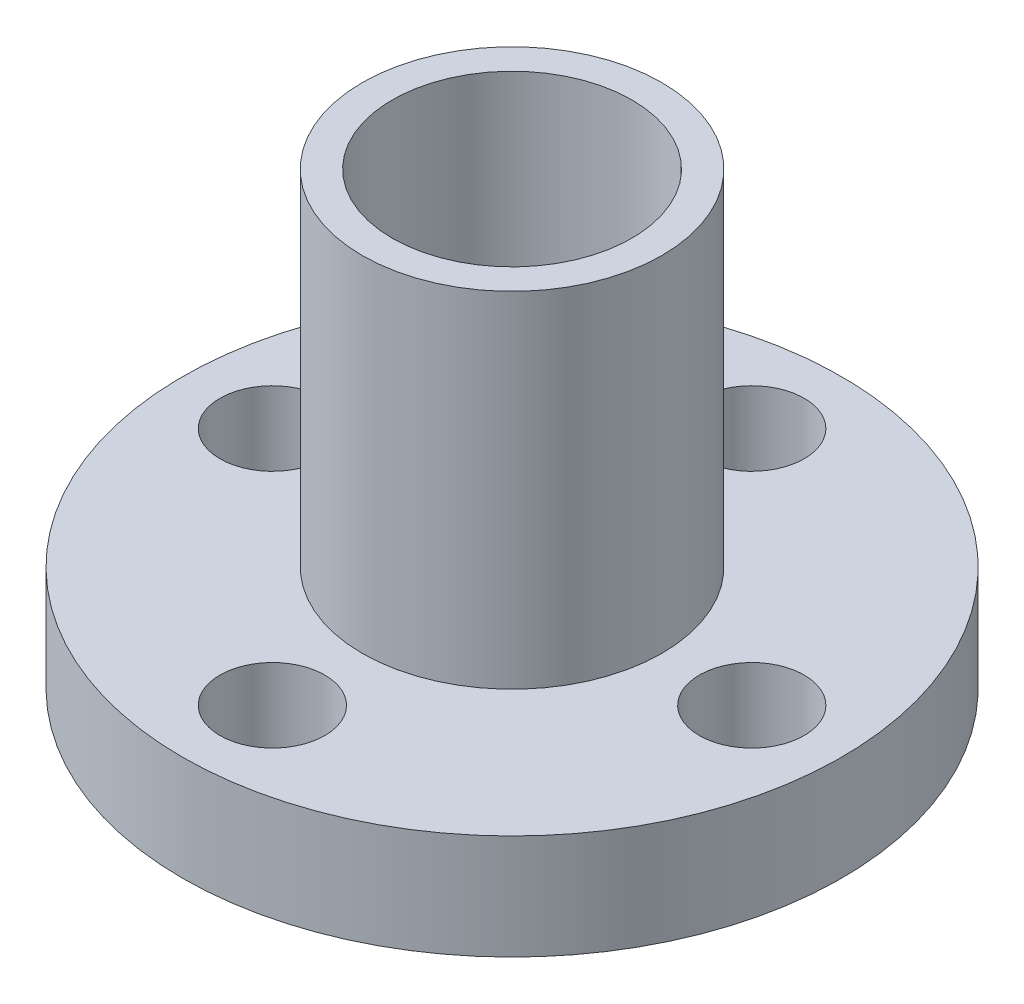
ISO-10303-21;
HEADER;
FILE_DESCRIPTION(('STEP AP214'),'2;1');
FILE_NAME('part.step','',(''),(''),'','','');
FILE_SCHEMA(('AUTOMOTIVE_DESIGN { 1 0 10303 214 1 1 1 1 }'));
ENDSEC;
DATA;
#1=APPLICATION_CONTEXT('core data for automotive mechanical design processes');
#2=APPLICATION_PROTOCOL_DEFINITION('international standard','automotive_design',2000,#1);
#3=PRODUCT_CONTEXT('',#1,'mechanical');
#4=PRODUCT('Part','Part','',(#3));
#5=PRODUCT_RELATED_PRODUCT_CATEGORY('part','',(#4));
#6=PRODUCT_DEFINITION_FORMATION('','',#4);
#7=PRODUCT_DEFINITION_CONTEXT('part definition',#1,'design');
#8=PRODUCT_DEFINITION('design','',#6,#7);
#9=PRODUCT_DEFINITION_SHAPE('','',#8);
#10=(LENGTH_UNIT() NAMED_UNIT(*) SI_UNIT(.MILLI.,.METRE.));
#11=(NAMED_UNIT(*) PLANE_ANGLE_UNIT() SI_UNIT($,.RADIAN.));
#12=(NAMED_UNIT(*) SI_UNIT($,.STERADIAN.) SOLID_ANGLE_UNIT());
#13=UNCERTAINTY_MEASURE_WITH_UNIT(LENGTH_MEASURE(1.E-05),#10,'distance_accuracy_value','');
#14=(GEOMETRIC_REPRESENTATION_CONTEXT(3) GLOBAL_UNCERTAINTY_ASSIGNED_CONTEXT((#13)) GLOBAL_UNIT_ASSIGNED_CONTEXT((#10,
#11,#12)) REPRESENTATION_CONTEXT('',''));
#15=CARTESIAN_POINT('',(0.,0.,0.));
#16=DIRECTION('',(0.,0.,1.));
#17=DIRECTION('',(1.,0.,0.));
#18=AXIS2_PLACEMENT_3D('',#15,#16,#17);
#19=CARTESIAN_POINT('',(0.,3.5,0.));
#20=DIRECTION('',(0.,-1.,0.));
#21=DIRECTION('',(0.,0.,-1.));
#22=AXIS2_PLACEMENT_3D('',#19,#20,#21);
#23=CYLINDRICAL_SURFACE('',#22,11.);
#24=CARTESIAN_POINT('',(0.,3.5,0.));
#25=DIRECTION('',(0.,1.,0.));
#26=DIRECTION('',(0.,0.,1.));
#27=AXIS2_PLACEMENT_3D('',#24,#25,#26);
#28=CIRCLE('',#27,11.);
#29=CARTESIAN_POINT('',(0.,3.5,11.));
#30=VERTEX_POINT('',#29);
#31=EDGE_CURVE('E44',#30,#30,#28,.T.);
#32=ORIENTED_EDGE('',*,*,#31,.F.);
#33=EDGE_LOOP('',(#32));
#34=FACE_BOUND('',#33,.T.);
#35=CARTESIAN_POINT('',(0.,0.,0.));
#36=DIRECTION('',(0.,1.,0.));
#37=DIRECTION('',(0.,0.,1.));
#38=AXIS2_PLACEMENT_3D('',#35,#36,#37);
#39=CIRCLE('',#38,11.);
#40=CARTESIAN_POINT('',(0.,0.,11.));
#41=VERTEX_POINT('',#40);
#42=EDGE_CURVE('E40',#41,#41,#39,.T.);
#43=ORIENTED_EDGE('',*,*,#42,.T.);
#44=EDGE_LOOP('',(#43));
#45=FACE_BOUND('',#44,.T.);
#46=ADVANCED_FACE('F37',(#34,#45),#23,.T.);
#47=CARTESIAN_POINT('',(0.,3.5,0.));
#48=DIRECTION('',(0.,1.,0.));
#49=DIRECTION('',(0.,0.,1.));
#50=AXIS2_PLACEMENT_3D('',#47,#48,#49);
#51=PLANE('',#50);
#52=CARTESIAN_POINT('',(0.,3.5,-8.));
#53=DIRECTION('',(0.,1.,0.));
#54=DIRECTION('',(0.,0.,1.));
#55=AXIS2_PLACEMENT_3D('',#52,#53,#54);
#56=CIRCLE('',#55,1.75);
#57=CARTESIAN_POINT('',(0.,3.5,-6.25));
#58=VERTEX_POINT('',#57);
#59=EDGE_CURVE('E78',#58,#58,#56,.T.);
#60=ORIENTED_EDGE('',*,*,#59,.F.);
#61=EDGE_LOOP('',(#60));
#62=FACE_BOUND('',#61,.T.);
#63=CARTESIAN_POINT('',(8.00000000000023,3.5,-2.25904099284255E-13));
#64=DIRECTION('',(0.,1.,0.));
#65=DIRECTION('',(0.,0.,1.));
#66=AXIS2_PLACEMENT_3D('',#63,#64,#65);
#67=CIRCLE('',#66,1.75000000000018);
#68=CARTESIAN_POINT('',(8.00000000000023,3.5,1.74999999999995));
#69=VERTEX_POINT('',#68);
#70=EDGE_CURVE('E75',#69,#69,#67,.T.);
#71=ORIENTED_EDGE('',*,*,#70,.F.);
#72=EDGE_LOOP('',(#71));
#73=FACE_BOUND('',#72,.T.);
#74=CARTESIAN_POINT('',(4.51808198568511E-13,3.5,8.));
#75=DIRECTION('',(0.,1.,0.));
#76=DIRECTION('',(0.,0.,1.));
#77=AXIS2_PLACEMENT_3D('',#74,#75,#76);
#78=CIRCLE('',#77,1.75000000000049);
#79=CARTESIAN_POINT('',(4.51808198568511E-13,3.5,9.75000000000048));
#80=VERTEX_POINT('',#79);
#81=EDGE_CURVE('E69',#80,#80,#78,.T.);
#82=ORIENTED_EDGE('',*,*,#81,.F.);
#83=EDGE_LOOP('',(#82));
#84=FACE_BOUND('',#83,.T.);
#85=CARTESIAN_POINT('',(-7.99999999999977,3.5,2.26883816723573E-13));
#86=DIRECTION('',(0.,1.,0.));
#87=DIRECTION('',(0.,0.,1.));
#88=AXIS2_PLACEMENT_3D('',#85,#86,#87);
#89=CIRCLE('',#88,1.75000000000036);
#90=CARTESIAN_POINT('',(-7.99999999999977,3.5,1.75000000000059));
#91=VERTEX_POINT('',#90);
#92=EDGE_CURVE('E63',#91,#91,#89,.T.);
#93=ORIENTED_EDGE('',*,*,#92,.F.);
#94=EDGE_LOOP('',(#93));
#95=FACE_BOUND('',#94,.T.);
#96=CARTESIAN_POINT('',(0.,3.5,0.));
#97=DIRECTION('',(0.,1.,0.));
#98=DIRECTION('',(0.,0.,1.));
#99=AXIS2_PLACEMENT_3D('',#96,#97,#98);
#100=CIRCLE('',#99,5.);
#101=CARTESIAN_POINT('',(0.,3.5,5.));
#102=VERTEX_POINT('',#101);
#103=EDGE_CURVE('E10',#102,#102,#100,.T.);
#104=ORIENTED_EDGE('',*,*,#103,.F.);
#105=EDGE_LOOP('',(#104));
#106=FACE_BOUND('',#105,.T.);
#107=ORIENTED_EDGE('',*,*,#31,.T.);
#108=EDGE_LOOP('',(#107));
#109=FACE_BOUND('',#108,.T.);
#110=ADVANCED_FACE('F94',(#62,#73,#84,#95,#106,#109),#51,.T.);
#111=CARTESIAN_POINT('',(0.,0.,0.));
#112=DIRECTION('',(0.,1.,0.));
#113=DIRECTION('',(0.,0.,1.));
#114=AXIS2_PLACEMENT_3D('',#111,#112,#113);
#115=PLANE('',#114);
#116=CARTESIAN_POINT('',(0.,0.,-8.));
#117=DIRECTION('',(0.,1.,0.));
#118=DIRECTION('',(0.,0.,1.));
#119=AXIS2_PLACEMENT_3D('',#116,#117,#118);
#120=CIRCLE('',#119,1.75);
#121=CARTESIAN_POINT('',(0.,0.,-6.25));
#122=VERTEX_POINT('',#121);
#123=EDGE_CURVE('E57',#122,#122,#120,.T.);
#124=ORIENTED_EDGE('',*,*,#123,.T.);
#125=EDGE_LOOP('',(#124));
#126=FACE_BOUND('',#125,.T.);
#127=CARTESIAN_POINT('',(8.00000000000023,0.,-2.25904099284255E-13));
#128=DIRECTION('',(0.,1.,0.));
#129=DIRECTION('',(0.,0.,1.));
#130=AXIS2_PLACEMENT_3D('',#127,#128,#129);
#131=CIRCLE('',#130,1.75000000000018);
#132=CARTESIAN_POINT('',(8.00000000000023,0.,1.74999999999995));
#133=VERTEX_POINT('',#132);
#134=EDGE_CURVE('E72',#133,#133,#131,.T.);
#135=ORIENTED_EDGE('',*,*,#134,.T.);
#136=EDGE_LOOP('',(#135));
#137=FACE_BOUND('',#136,.T.);
#138=CARTESIAN_POINT('',(4.51808198568511E-13,0.,8.));
#139=DIRECTION('',(0.,1.,0.));
#140=DIRECTION('',(0.,0.,1.));
#141=AXIS2_PLACEMENT_3D('',#138,#139,#140);
#142=CIRCLE('',#141,1.75000000000049);
#143=CARTESIAN_POINT('',(4.51808198568511E-13,0.,9.75000000000048));
#144=VERTEX_POINT('',#143);
#145=EDGE_CURVE('E66',#144,#144,#142,.T.);
#146=ORIENTED_EDGE('',*,*,#145,.T.);
#147=EDGE_LOOP('',(#146));
#148=FACE_BOUND('',#147,.T.);
#149=CARTESIAN_POINT('',(-7.99999999999977,0.,2.26883816723573E-13));
#150=DIRECTION('',(0.,1.,0.));
#151=DIRECTION('',(0.,0.,1.));
#152=AXIS2_PLACEMENT_3D('',#149,#150,#151);
#153=CIRCLE('',#152,1.75000000000036);
#154=CARTESIAN_POINT('',(-7.99999999999977,0.,1.75000000000059));
#155=VERTEX_POINT('',#154);
#156=EDGE_CURVE('E60',#155,#155,#153,.T.);
#157=ORIENTED_EDGE('',*,*,#156,.T.);
#158=EDGE_LOOP('',(#157));
#159=FACE_BOUND('',#158,.T.);
#160=CARTESIAN_POINT('',(0.,0.,0.));
#161=DIRECTION('',(0.,1.,0.));
#162=DIRECTION('',(0.,0.,1.));
#163=AXIS2_PLACEMENT_3D('',#160,#161,#162);
#164=CIRCLE('',#163,4.);
#165=CARTESIAN_POINT('',(0.,0.,4.));
#166=VERTEX_POINT('',#165);
#167=EDGE_CURVE('E53',#166,#166,#164,.T.);
#168=ORIENTED_EDGE('',*,*,#167,.T.);
#169=EDGE_LOOP('',(#168));
#170=FACE_BOUND('',#169,.T.);
#171=ORIENTED_EDGE('',*,*,#42,.F.);
#172=EDGE_LOOP('',(#171));
#173=FACE_BOUND('',#172,.T.);
#174=ADVANCED_FACE('F84',(#126,#137,#148,#159,#170,#173),#115,.F.);
#175=CARTESIAN_POINT('',(0.,15.,0.));
#176=DIRECTION('',(0.,-1.,0.));
#177=DIRECTION('',(0.,0.,-1.));
#178=AXIS2_PLACEMENT_3D('',#175,#176,#177);
#179=CYLINDRICAL_SURFACE('',#178,5.);
#180=CARTESIAN_POINT('',(0.,15.,0.));
#181=DIRECTION('',(0.,1.,0.));
#182=DIRECTION('',(0.,0.,1.));
#183=AXIS2_PLACEMENT_3D('',#180,#181,#182);
#184=CIRCLE('',#183,5.);
#185=CARTESIAN_POINT('',(0.,15.,5.));
#186=VERTEX_POINT('',#185);
#187=EDGE_CURVE('E50',#186,#186,#184,.T.);
#188=ORIENTED_EDGE('',*,*,#187,.F.);
#189=EDGE_LOOP('',(#188));
#190=FACE_BOUND('',#189,.T.);
#191=ORIENTED_EDGE('',*,*,#103,.T.);
#192=EDGE_LOOP('',(#191));
#193=FACE_BOUND('',#192,.T.);
#194=ADVANCED_FACE('F113',(#190,#193),#179,.T.);
#195=CARTESIAN_POINT('',(0.,15.,0.));
#196=DIRECTION('',(0.,1.,0.));
#197=DIRECTION('',(0.,0.,1.));
#198=AXIS2_PLACEMENT_3D('',#195,#196,#197);
#199=PLANE('',#198);
#200=CARTESIAN_POINT('',(0.,15.,0.));
#201=DIRECTION('',(0.,1.,0.));
#202=DIRECTION('',(0.,0.,1.));
#203=AXIS2_PLACEMENT_3D('',#200,#201,#202);
#204=CIRCLE('',#203,4.);
#205=CARTESIAN_POINT('',(0.,15.,4.));
#206=VERTEX_POINT('',#205);
#207=EDGE_CURVE('E54',#206,#206,#204,.T.);
#208=ORIENTED_EDGE('',*,*,#207,.F.);
#209=EDGE_LOOP('',(#208));
#210=FACE_BOUND('',#209,.T.);
#211=ORIENTED_EDGE('',*,*,#187,.T.);
#212=EDGE_LOOP('',(#211));
#213=FACE_BOUND('',#212,.T.);
#214=ADVANCED_FACE('F117',(#210,#213),#199,.T.);
#215=CARTESIAN_POINT('',(0.,0.,0.));
#216=DIRECTION('',(0.,1.,0.));
#217=DIRECTION('',(0.,0.,1.));
#218=AXIS2_PLACEMENT_3D('',#215,#216,#217);
#219=CYLINDRICAL_SURFACE('',#218,4.);
#220=ORIENTED_EDGE('',*,*,#167,.F.);
#221=EDGE_LOOP('',(#220));
#222=FACE_BOUND('',#221,.T.);
#223=ORIENTED_EDGE('',*,*,#207,.T.);
#224=EDGE_LOOP('',(#223));
#225=FACE_BOUND('',#224,.T.);
#226=ADVANCED_FACE('F123',(#222,#225),#219,.F.);
#227=CARTESIAN_POINT('',(-7.99999999999977,0.,2.26883816723573E-13));
#228=DIRECTION('',(0.,1.,0.));
#229=DIRECTION('',(0.,0.,1.));
#230=AXIS2_PLACEMENT_3D('',#227,#228,#229);
#231=CYLINDRICAL_SURFACE('',#230,1.75000000000036);
#232=ORIENTED_EDGE('',*,*,#156,.F.);
#233=EDGE_LOOP('',(#232));
#234=FACE_BOUND('',#233,.T.);
#235=ORIENTED_EDGE('',*,*,#92,.T.);
#236=EDGE_LOOP('',(#235));
#237=FACE_BOUND('',#236,.T.);
#238=ADVANCED_FACE('F127',(#234,#237),#231,.F.);
#239=CARTESIAN_POINT('',(4.51808198568511E-13,0.,8.));
#240=DIRECTION('',(0.,1.,0.));
#241=DIRECTION('',(0.,0.,1.));
#242=AXIS2_PLACEMENT_3D('',#239,#240,#241);
#243=CYLINDRICAL_SURFACE('',#242,1.75000000000049);
#244=ORIENTED_EDGE('',*,*,#145,.F.);
#245=EDGE_LOOP('',(#244));
#246=FACE_BOUND('',#245,.T.);
#247=ORIENTED_EDGE('',*,*,#81,.T.);
#248=EDGE_LOOP('',(#247));
#249=FACE_BOUND('',#248,.T.);
#250=ADVANCED_FACE('F131',(#246,#249),#243,.F.);
#251=CARTESIAN_POINT('',(8.00000000000023,0.,-2.25904099284255E-13));
#252=DIRECTION('',(0.,1.,0.));
#253=DIRECTION('',(0.,0.,1.));
#254=AXIS2_PLACEMENT_3D('',#251,#252,#253);
#255=CYLINDRICAL_SURFACE('',#254,1.75000000000018);
#256=ORIENTED_EDGE('',*,*,#134,.F.);
#257=EDGE_LOOP('',(#256));
#258=FACE_BOUND('',#257,.T.);
#259=ORIENTED_EDGE('',*,*,#70,.T.);
#260=EDGE_LOOP('',(#259));
#261=FACE_BOUND('',#260,.T.);
#262=ADVANCED_FACE('F90',(#258,#261),#255,.F.);
#263=CARTESIAN_POINT('',(0.,0.,-8.));
#264=DIRECTION('',(0.,1.,0.));
#265=DIRECTION('',(0.,0.,1.));
#266=AXIS2_PLACEMENT_3D('',#263,#264,#265);
#267=CYLINDRICAL_SURFACE('',#266,1.75);
#268=ORIENTED_EDGE('',*,*,#123,.F.);
#269=EDGE_LOOP('',(#268));
#270=FACE_BOUND('',#269,.T.);
#271=ORIENTED_EDGE('',*,*,#59,.T.);
#272=EDGE_LOOP('',(#271));
#273=FACE_BOUND('',#272,.T.);
#274=ADVANCED_FACE('F87',(#270,#273),#267,.F.);
#275=CLOSED_SHELL('',(#46,#110,#174,#194,#214,#226,#238,#250,#262,#274));
#276=MANIFOLD_SOLID_BREP('B2',#275);
#277=ADVANCED_BREP_SHAPE_REPRESENTATION('',(#18,#276),#14);
#278=SHAPE_DEFINITION_REPRESENTATION(#9,#277);
ENDSEC;
END-ISO-10303-21;
